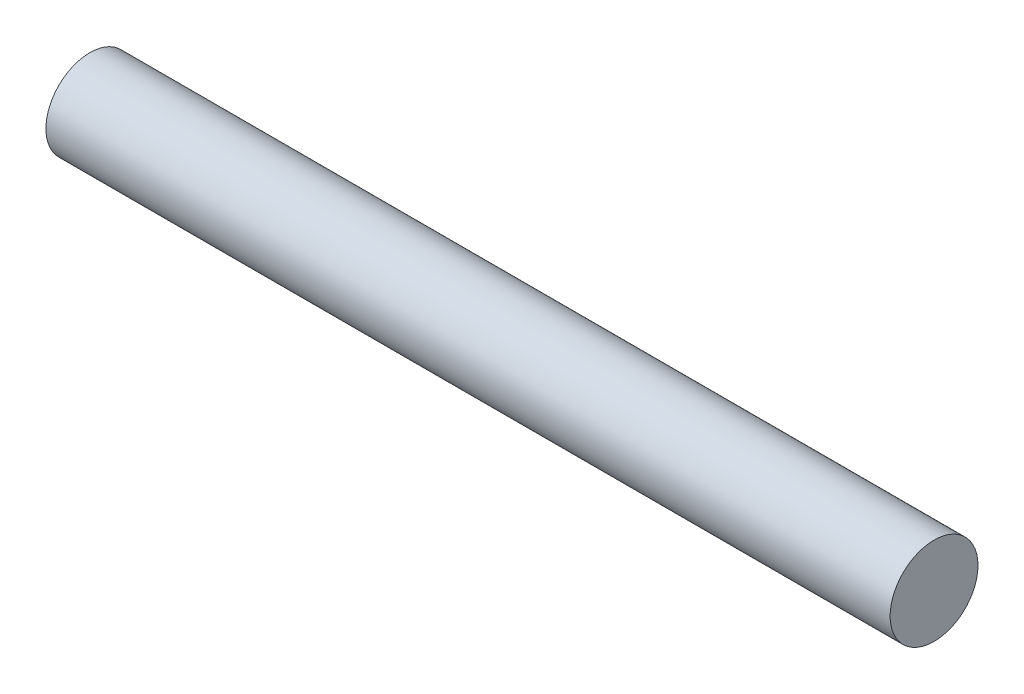
ISO-10303-21;
HEADER;
FILE_DESCRIPTION(('STEP AP214'),'2;1');
FILE_NAME('part.step','',(''),(''),'','','');
FILE_SCHEMA(('AUTOMOTIVE_DESIGN { 1 0 10303 214 1 1 1 1 }'));
ENDSEC;
DATA;
#1=APPLICATION_CONTEXT('core data for automotive mechanical design processes');
#2=APPLICATION_PROTOCOL_DEFINITION('international standard','automotive_design',2000,#1);
#3=PRODUCT_CONTEXT('',#1,'mechanical');
#4=PRODUCT('Part','Part','',(#3));
#5=PRODUCT_RELATED_PRODUCT_CATEGORY('part','',(#4));
#6=PRODUCT_DEFINITION_FORMATION('','',#4);
#7=PRODUCT_DEFINITION_CONTEXT('part definition',#1,'design');
#8=PRODUCT_DEFINITION('design','',#6,#7);
#9=PRODUCT_DEFINITION_SHAPE('','',#8);
#10=(LENGTH_UNIT() NAMED_UNIT(*) SI_UNIT(.MILLI.,.METRE.));
#11=(NAMED_UNIT(*) PLANE_ANGLE_UNIT() SI_UNIT($,.RADIAN.));
#12=(NAMED_UNIT(*) SI_UNIT($,.STERADIAN.) SOLID_ANGLE_UNIT());
#13=UNCERTAINTY_MEASURE_WITH_UNIT(LENGTH_MEASURE(1.E-05),#10,'distance_accuracy_value','');
#14=(GEOMETRIC_REPRESENTATION_CONTEXT(3) GLOBAL_UNCERTAINTY_ASSIGNED_CONTEXT((#13)) GLOBAL_UNIT_ASSIGNED_CONTEXT((#10,
#11,#12)) REPRESENTATION_CONTEXT('',''));
#15=CARTESIAN_POINT('',(0.,0.,0.));
#16=DIRECTION('',(0.,0.,1.));
#17=DIRECTION('',(1.,0.,0.));
#18=AXIS2_PLACEMENT_3D('',#15,#16,#17);
#19=CARTESIAN_POINT('',(37.,0.,0.));
#20=DIRECTION('',(-1.,0.,0.));
#21=DIRECTION('',(0.,0.,1.));
#22=AXIS2_PLACEMENT_3D('',#19,#20,#21);
#23=CYLINDRICAL_SURFACE('',#22,3.85);
#24=CARTESIAN_POINT('',(37.,0.,0.));
#25=DIRECTION('',(1.,0.,0.));
#26=DIRECTION('',(0.,0.,-1.));
#27=AXIS2_PLACEMENT_3D('',#24,#25,#26);
#28=CIRCLE('',#27,3.85);
#29=CARTESIAN_POINT('',(37.,0.,-3.85));
#30=VERTEX_POINT('',#29);
#31=EDGE_CURVE('E10',#30,#30,#28,.T.);
#32=ORIENTED_EDGE('',*,*,#31,.F.);
#33=EDGE_LOOP('',(#32));
#34=FACE_BOUND('',#33,.T.);
#35=CARTESIAN_POINT('',(-37.,0.,0.));
#36=DIRECTION('',(1.,0.,0.));
#37=DIRECTION('',(0.,0.,-1.));
#38=AXIS2_PLACEMENT_3D('',#35,#36,#37);
#39=CIRCLE('',#38,3.85);
#40=CARTESIAN_POINT('',(-37.,0.,-3.85));
#41=VERTEX_POINT('',#40);
#42=EDGE_CURVE('E46',#41,#41,#39,.T.);
#43=ORIENTED_EDGE('',*,*,#42,.T.);
#44=EDGE_LOOP('',(#43));
#45=FACE_BOUND('',#44,.T.);
#46=ADVANCED_FACE('F43',(#34,#45),#23,.T.);
#47=CARTESIAN_POINT('',(37.,0.,0.));
#48=DIRECTION('',(1.,0.,0.));
#49=DIRECTION('',(0.,0.,-1.));
#50=AXIS2_PLACEMENT_3D('',#47,#48,#49);
#51=PLANE('',#50);
#52=ORIENTED_EDGE('',*,*,#31,.T.);
#53=EDGE_LOOP('',(#52));
#54=FACE_BOUND('',#53,.T.);
#55=ADVANCED_FACE('F60',(#54),#51,.T.);
#56=CARTESIAN_POINT('',(-37.,0.,0.));
#57=DIRECTION('',(1.,0.,0.));
#58=DIRECTION('',(0.,0.,-1.));
#59=AXIS2_PLACEMENT_3D('',#56,#57,#58);
#60=PLANE('',#59);
#61=ORIENTED_EDGE('',*,*,#42,.F.);
#62=EDGE_LOOP('',(#61));
#63=FACE_BOUND('',#62,.T.);
#64=ADVANCED_FACE('F58',(#63),#60,.F.);
#65=CLOSED_SHELL('',(#46,#55,#64));
#66=MANIFOLD_SOLID_BREP('B2',#65);
#67=ADVANCED_BREP_SHAPE_REPRESENTATION('',(#18,#66),#14);
#68=SHAPE_DEFINITION_REPRESENTATION(#9,#67);
ENDSEC;
END-ISO-10303-21;
